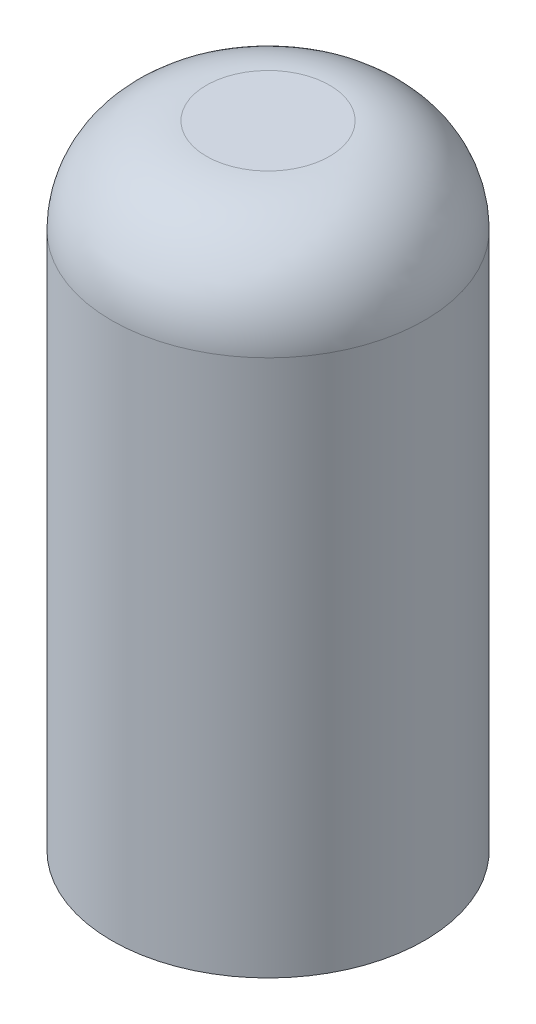
ISO-10303-21;
HEADER;
FILE_DESCRIPTION(('STEP AP214'),'2;1');
FILE_NAME('part.step','',(''),(''),'','','');
FILE_SCHEMA(('AUTOMOTIVE_DESIGN { 1 0 10303 214 1 1 1 1 }'));
ENDSEC;
DATA;
#1=APPLICATION_CONTEXT('core data for automotive mechanical design processes');
#2=APPLICATION_PROTOCOL_DEFINITION('international standard','automotive_design',2000,#1);
#3=PRODUCT_CONTEXT('',#1,'mechanical');
#4=PRODUCT('Part','Part','',(#3));
#5=PRODUCT_RELATED_PRODUCT_CATEGORY('part','',(#4));
#6=PRODUCT_DEFINITION_FORMATION('','',#4);
#7=PRODUCT_DEFINITION_CONTEXT('part definition',#1,'design');
#8=PRODUCT_DEFINITION('design','',#6,#7);
#9=PRODUCT_DEFINITION_SHAPE('','',#8);
#10=(LENGTH_UNIT() NAMED_UNIT(*) SI_UNIT(.MILLI.,.METRE.));
#11=(NAMED_UNIT(*) PLANE_ANGLE_UNIT() SI_UNIT($,.RADIAN.));
#12=(NAMED_UNIT(*) SI_UNIT($,.STERADIAN.) SOLID_ANGLE_UNIT());
#13=UNCERTAINTY_MEASURE_WITH_UNIT(LENGTH_MEASURE(1.E-05),#10,'distance_accuracy_value','');
#14=(GEOMETRIC_REPRESENTATION_CONTEXT(3) GLOBAL_UNCERTAINTY_ASSIGNED_CONTEXT((#13)) GLOBAL_UNIT_ASSIGNED_CONTEXT((#10,
#11,#12)) REPRESENTATION_CONTEXT('',''));
#15=CARTESIAN_POINT('',(0.,0.,0.));
#16=DIRECTION('',(0.,0.,1.));
#17=DIRECTION('',(1.,0.,0.));
#18=AXIS2_PLACEMENT_3D('',#15,#16,#17);
#19=CARTESIAN_POINT('',(0.,20.,0.));
#20=DIRECTION('',(0.,-1.,0.));
#21=DIRECTION('',(0.,0.,-1.));
#22=AXIS2_PLACEMENT_3D('',#19,#20,#21);
#23=CYLINDRICAL_SURFACE('',#22,4.95);
#24=CARTESIAN_POINT('',(0.,17.,0.));
#25=DIRECTION('',(0.,1.,0.));
#26=DIRECTION('',(0.,0.,1.));
#27=AXIS2_PLACEMENT_3D('',#24,#25,#26);
#28=CIRCLE('',#27,4.95);
#29=CARTESIAN_POINT('',(0.,17.,4.95));
#30=VERTEX_POINT('',#29);
#31=EDGE_CURVE('E10',#30,#30,#28,.F.);
#32=ORIENTED_EDGE('',*,*,#31,.T.);
#33=EDGE_LOOP('',(#32));
#34=FACE_BOUND('',#33,.T.);
#35=CARTESIAN_POINT('',(0.,0.,0.));
#36=DIRECTION('',(0.,1.,0.));
#37=DIRECTION('',(0.,0.,1.));
#38=AXIS2_PLACEMENT_3D('',#35,#36,#37);
#39=CIRCLE('',#38,4.95);
#40=CARTESIAN_POINT('',(0.,0.,4.95));
#41=VERTEX_POINT('',#40);
#42=EDGE_CURVE('E46',#41,#41,#39,.T.);
#43=ORIENTED_EDGE('',*,*,#42,.T.);
#44=EDGE_LOOP('',(#43));
#45=FACE_BOUND('',#44,.T.);
#46=ADVANCED_FACE('F35',(#34,#45),#23,.T.);
#47=CARTESIAN_POINT('',(0.,20.,0.));
#48=DIRECTION('',(0.,1.,0.));
#49=DIRECTION('',(0.,0.,1.));
#50=AXIS2_PLACEMENT_3D('',#47,#48,#49);
#51=PLANE('',#50);
#52=CARTESIAN_POINT('',(0.,20.,0.));
#53=DIRECTION('',(0.,1.,0.));
#54=DIRECTION('',(0.,0.,1.));
#55=AXIS2_PLACEMENT_3D('',#52,#53,#54);
#56=CIRCLE('',#55,1.95);
#57=CARTESIAN_POINT('',(0.,20.,1.95));
#58=VERTEX_POINT('',#57);
#59=EDGE_CURVE('E42',#58,#58,#56,.T.);
#60=ORIENTED_EDGE('',*,*,#59,.T.);
#61=EDGE_LOOP('',(#60));
#62=FACE_BOUND('',#61,.T.);
#63=ADVANCED_FACE('F56',(#62),#51,.T.);
#64=CARTESIAN_POINT('',(0.,0.,0.));
#65=DIRECTION('',(0.,1.,0.));
#66=DIRECTION('',(0.,0.,1.));
#67=AXIS2_PLACEMENT_3D('',#64,#65,#66);
#68=PLANE('',#67);
#69=ORIENTED_EDGE('',*,*,#42,.F.);
#70=EDGE_LOOP('',(#69));
#71=FACE_BOUND('',#70,.T.);
#72=ADVANCED_FACE('F54',(#71),#68,.F.);
#73=CARTESIAN_POINT('',(0.,17.,0.));
#74=DIRECTION('',(0.,1.,0.));
#75=DIRECTION('',(0.,0.,1.));
#76=AXIS2_PLACEMENT_3D('',#73,#74,#75);
#77=DEGENERATE_TOROIDAL_SURFACE('',#76,1.95,3.,.T.);
#78=ORIENTED_EDGE('',*,*,#31,.F.);
#79=EDGE_LOOP('',(#78));
#80=FACE_BOUND('',#79,.T.);
#81=ORIENTED_EDGE('',*,*,#59,.F.);
#82=EDGE_LOOP('',(#81));
#83=FACE_BOUND('',#82,.T.);
#84=ADVANCED_FACE('F37',(#80,#83),#77,.T.);
#85=CLOSED_SHELL('',(#46,#63,#72,#84));
#86=MANIFOLD_SOLID_BREP('B2',#85);
#87=ADVANCED_BREP_SHAPE_REPRESENTATION('',(#18,#86),#14);
#88=SHAPE_DEFINITION_REPRESENTATION(#9,#87);
ENDSEC;
END-ISO-10303-21;
